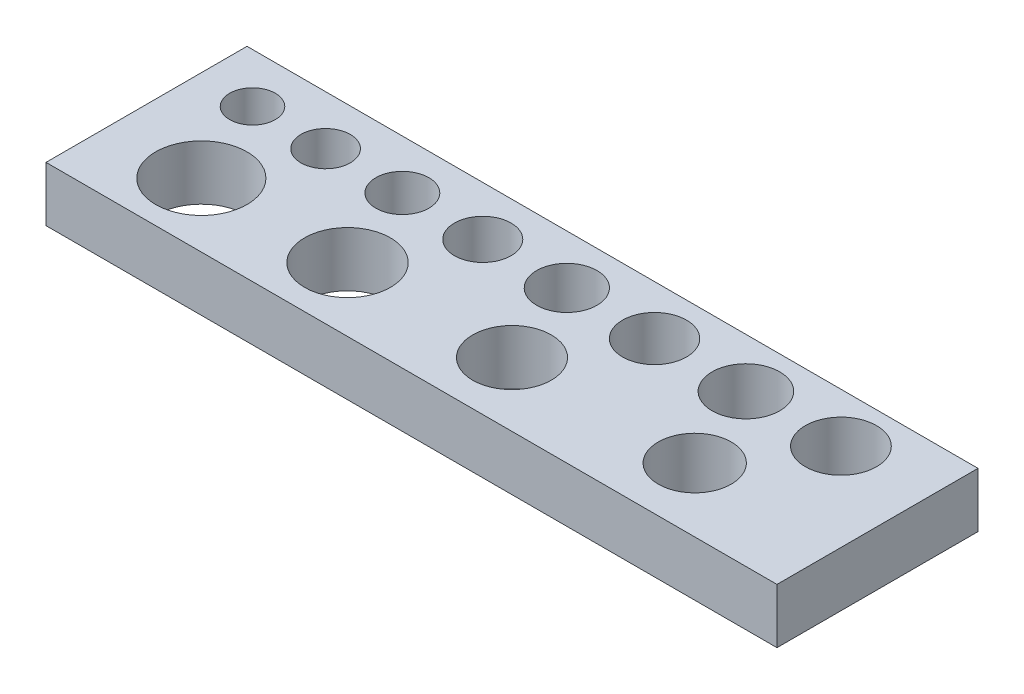
ISO-10303-21;
HEADER;
FILE_DESCRIPTION(('STEP AP214'),'2;1');
FILE_NAME('part.step','',(''),(''),'','','');
FILE_SCHEMA(('AUTOMOTIVE_DESIGN { 1 0 10303 214 1 1 1 1 }'));
ENDSEC;
DATA;
#1=APPLICATION_CONTEXT('core data for automotive mechanical design processes');
#2=APPLICATION_PROTOCOL_DEFINITION('international standard','automotive_design',2000,#1);
#3=PRODUCT_CONTEXT('',#1,'mechanical');
#4=PRODUCT('Part','Part','',(#3));
#5=PRODUCT_RELATED_PRODUCT_CATEGORY('part','',(#4));
#6=PRODUCT_DEFINITION_FORMATION('','',#4);
#7=PRODUCT_DEFINITION_CONTEXT('part definition',#1,'design');
#8=PRODUCT_DEFINITION('design','',#6,#7);
#9=PRODUCT_DEFINITION_SHAPE('','',#8);
#10=(LENGTH_UNIT() NAMED_UNIT(*) SI_UNIT(.MILLI.,.METRE.));
#11=(NAMED_UNIT(*) PLANE_ANGLE_UNIT() SI_UNIT($,.RADIAN.));
#12=(NAMED_UNIT(*) SI_UNIT($,.STERADIAN.) SOLID_ANGLE_UNIT());
#13=UNCERTAINTY_MEASURE_WITH_UNIT(LENGTH_MEASURE(1.E-05),#10,'distance_accuracy_value','');
#14=(GEOMETRIC_REPRESENTATION_CONTEXT(3) GLOBAL_UNCERTAINTY_ASSIGNED_CONTEXT((#13)) GLOBAL_UNIT_ASSIGNED_CONTEXT((#10,
#11,#12)) REPRESENTATION_CONTEXT('',''));
#15=CARTESIAN_POINT('',(0.,0.,0.));
#16=DIRECTION('',(0.,0.,1.));
#17=DIRECTION('',(1.,0.,0.));
#18=AXIS2_PLACEMENT_3D('',#15,#16,#17);
#19=CARTESIAN_POINT('',(-20.,3.,5.5));
#20=DIRECTION('',(1.,0.,0.));
#21=DIRECTION('',(0.,0.,-1.));
#22=AXIS2_PLACEMENT_3D('',#19,#20,#21);
#23=PLANE('',#22);
#24=DIRECTION('',(0.,0.,1.));
#25=VECTOR('',#24,1.);
#26=CARTESIAN_POINT('',(-20.,0.,5.5));
#27=LINE('',#26,#25);
#28=CARTESIAN_POINT('',(-20.,0.,-5.5));
#29=VERTEX_POINT('',#28);
#30=CARTESIAN_POINT('',(-20.,0.,5.5));
#31=VERTEX_POINT('',#30);
#32=EDGE_CURVE('E97',#29,#31,#27,.T.);
#33=ORIENTED_EDGE('',*,*,#32,.T.);
#34=DIRECTION('',(0.,-1.,0.));
#35=VECTOR('',#34,1.);
#36=CARTESIAN_POINT('',(-20.,3.,5.5));
#37=LINE('',#36,#35);
#38=CARTESIAN_POINT('',(-20.,3.,5.5));
#39=VERTEX_POINT('',#38);
#40=EDGE_CURVE('E11',#39,#31,#37,.T.);
#41=ORIENTED_EDGE('',*,*,#40,.F.);
#42=DIRECTION('',(0.,0.,1.));
#43=VECTOR('',#42,1.);
#44=CARTESIAN_POINT('',(-20.,3.,5.5));
#45=LINE('',#44,#43);
#46=CARTESIAN_POINT('',(-20.,3.,-5.5));
#47=VERTEX_POINT('',#46);
#48=EDGE_CURVE('E85',#47,#39,#45,.T.);
#49=ORIENTED_EDGE('',*,*,#48,.F.);
#50=DIRECTION('',(0.,-1.,0.));
#51=VECTOR('',#50,1.);
#52=CARTESIAN_POINT('',(-20.,3.,-5.5));
#53=LINE('',#52,#51);
#54=EDGE_CURVE('E93',#47,#29,#53,.T.);
#55=ORIENTED_EDGE('',*,*,#54,.T.);
#56=EDGE_LOOP('',(#33,#41,#49,#55));
#57=FACE_BOUND('',#56,.T.);
#58=ADVANCED_FACE('F34',(#57),#23,.F.);
#59=CARTESIAN_POINT('',(20.,3.,5.5));
#60=DIRECTION('',(0.,0.,-1.));
#61=DIRECTION('',(-1.,0.,0.));
#62=AXIS2_PLACEMENT_3D('',#59,#60,#61);
#63=PLANE('',#62);
#64=DIRECTION('',(1.,0.,0.));
#65=VECTOR('',#64,1.);
#66=CARTESIAN_POINT('',(20.,0.,5.5));
#67=LINE('',#66,#65);
#68=CARTESIAN_POINT('',(20.,0.,5.5));
#69=VERTEX_POINT('',#68);
#70=EDGE_CURVE('E89',#31,#69,#67,.T.);
#71=ORIENTED_EDGE('',*,*,#70,.T.);
#72=DIRECTION('',(0.,-1.,0.));
#73=VECTOR('',#72,1.);
#74=CARTESIAN_POINT('',(20.,3.,5.5));
#75=LINE('',#74,#73);
#76=CARTESIAN_POINT('',(20.,3.,5.5));
#77=VERTEX_POINT('',#76);
#78=EDGE_CURVE('E42',#77,#69,#75,.T.);
#79=ORIENTED_EDGE('',*,*,#78,.F.);
#80=DIRECTION('',(1.,0.,0.));
#81=VECTOR('',#80,1.);
#82=CARTESIAN_POINT('',(20.,3.,5.5));
#83=LINE('',#82,#81);
#84=EDGE_CURVE('E80',#39,#77,#83,.T.);
#85=ORIENTED_EDGE('',*,*,#84,.F.);
#86=ORIENTED_EDGE('',*,*,#40,.T.);
#87=EDGE_LOOP('',(#71,#79,#85,#86));
#88=FACE_BOUND('',#87,.T.);
#89=ADVANCED_FACE('F88',(#88),#63,.F.);
#90=CARTESIAN_POINT('',(20.,3.,5.5));
#91=DIRECTION('',(-1.,0.,0.));
#92=DIRECTION('',(0.,0.,1.));
#93=AXIS2_PLACEMENT_3D('',#90,#91,#92);
#94=PLANE('',#93);
#95=DIRECTION('',(0.,0.,-1.));
#96=VECTOR('',#95,1.);
#97=CARTESIAN_POINT('',(20.,0.,5.5));
#98=LINE('',#97,#96);
#99=CARTESIAN_POINT('',(20.,0.,-5.5));
#100=VERTEX_POINT('',#99);
#101=EDGE_CURVE('E67',#69,#100,#98,.T.);
#102=ORIENTED_EDGE('',*,*,#101,.T.);
#103=DIRECTION('',(0.,-1.,0.));
#104=VECTOR('',#103,1.);
#105=CARTESIAN_POINT('',(20.,3.,-5.5));
#106=LINE('',#105,#104);
#107=CARTESIAN_POINT('',(20.,3.,-5.5));
#108=VERTEX_POINT('',#107);
#109=EDGE_CURVE('E90',#108,#100,#106,.T.);
#110=ORIENTED_EDGE('',*,*,#109,.F.);
#111=DIRECTION('',(0.,0.,-1.));
#112=VECTOR('',#111,1.);
#113=CARTESIAN_POINT('',(20.,3.,5.5));
#114=LINE('',#113,#112);
#115=EDGE_CURVE('E83',#77,#108,#114,.T.);
#116=ORIENTED_EDGE('',*,*,#115,.F.);
#117=ORIENTED_EDGE('',*,*,#78,.T.);
#118=EDGE_LOOP('',(#102,#110,#116,#117));
#119=FACE_BOUND('',#118,.T.);
#120=ADVANCED_FACE('F91',(#119),#94,.F.);
#121=CARTESIAN_POINT('',(20.,3.,-5.5));
#122=DIRECTION('',(0.,0.,1.));
#123=DIRECTION('',(1.,0.,0.));
#124=AXIS2_PLACEMENT_3D('',#121,#122,#123);
#125=PLANE('',#124);
#126=DIRECTION('',(-1.,0.,0.));
#127=VECTOR('',#126,1.);
#128=CARTESIAN_POINT('',(20.,0.,-5.5));
#129=LINE('',#128,#127);
#130=EDGE_CURVE('E73',#100,#29,#129,.T.);
#131=ORIENTED_EDGE('',*,*,#130,.T.);
#132=ORIENTED_EDGE('',*,*,#54,.F.);
#133=DIRECTION('',(-1.,0.,0.));
#134=VECTOR('',#133,1.);
#135=CARTESIAN_POINT('',(20.,3.,-5.5));
#136=LINE('',#135,#134);
#137=EDGE_CURVE('E50',#108,#47,#136,.T.);
#138=ORIENTED_EDGE('',*,*,#137,.F.);
#139=ORIENTED_EDGE('',*,*,#109,.T.);
#140=EDGE_LOOP('',(#131,#132,#138,#139));
#141=FACE_BOUND('',#140,.T.);
#142=ADVANCED_FACE('F105',(#141),#125,.F.);
#143=CARTESIAN_POINT('',(0.,3.,0.));
#144=DIRECTION('',(0.,1.,0.));
#145=DIRECTION('',(0.,0.,1.));
#146=AXIS2_PLACEMENT_3D('',#143,#144,#145);
#147=PLANE('',#146);
#148=CARTESIAN_POINT('',(5.00000000000001,3.,-2.8));
#149=DIRECTION('',(0.,1.,0.));
#150=DIRECTION('',(0.,0.,1.));
#151=AXIS2_PLACEMENT_3D('',#148,#149,#150);
#152=CIRCLE('',#151,1.75);
#153=CARTESIAN_POINT('',(5.00000000000001,3.,-1.05));
#154=VERTEX_POINT('',#153);
#155=EDGE_CURVE('E148',#154,#154,#152,.T.);
#156=ORIENTED_EDGE('',*,*,#155,.F.);
#157=EDGE_LOOP('',(#156));
#158=FACE_BOUND('',#157,.T.);
#159=CARTESIAN_POINT('',(10.,3.,-2.8));
#160=DIRECTION('',(0.,1.,0.));
#161=DIRECTION('',(0.,0.,1.));
#162=AXIS2_PLACEMENT_3D('',#159,#160,#161);
#163=CIRCLE('',#162,1.85);
#164=CARTESIAN_POINT('',(10.,3.,-0.95));
#165=VERTEX_POINT('',#164);
#166=EDGE_CURVE('E141',#165,#165,#163,.T.);
#167=ORIENTED_EDGE('',*,*,#166,.F.);
#168=EDGE_LOOP('',(#167));
#169=FACE_BOUND('',#168,.T.);
#170=CARTESIAN_POINT('',(15.2,3.,-2.8));
#171=DIRECTION('',(0.,1.,0.));
#172=DIRECTION('',(0.,0.,1.));
#173=AXIS2_PLACEMENT_3D('',#170,#171,#172);
#174=CIRCLE('',#173,1.95);
#175=CARTESIAN_POINT('',(15.2,3.,-0.850000000000002));
#176=VERTEX_POINT('',#175);
#177=EDGE_CURVE('E160',#176,#176,#174,.T.);
#178=ORIENTED_EDGE('',*,*,#177,.F.);
#179=EDGE_LOOP('',(#178));
#180=FACE_BOUND('',#179,.T.);
#181=CARTESIAN_POINT('',(2.00000000000001,3.,2.));
#182=DIRECTION('',(0.,1.,0.));
#183=DIRECTION('',(0.,0.,1.));
#184=AXIS2_PLACEMENT_3D('',#181,#182,#183);
#185=CIRCLE('',#184,2.15);
#186=CARTESIAN_POINT('',(2.00000000000001,3.,4.15));
#187=VERTEX_POINT('',#186);
#188=EDGE_CURVE('E153',#187,#187,#185,.T.);
#189=ORIENTED_EDGE('',*,*,#188,.F.);
#190=EDGE_LOOP('',(#189));
#191=FACE_BOUND('',#190,.T.);
#192=CARTESIAN_POINT('',(0.200000000000007,3.,-2.8));
#193=DIRECTION('',(0.,1.,0.));
#194=DIRECTION('',(0.,0.,1.));
#195=AXIS2_PLACEMENT_3D('',#192,#193,#194);
#196=CIRCLE('',#195,1.65);
#197=CARTESIAN_POINT('',(0.200000000000007,3.,-1.15));
#198=VERTEX_POINT('',#197);
#199=EDGE_CURVE('E117',#198,#198,#196,.T.);
#200=ORIENTED_EDGE('',*,*,#199,.F.);
#201=EDGE_LOOP('',(#200));
#202=FACE_BOUND('',#201,.T.);
#203=CARTESIAN_POINT('',(-4.39999999999999,3.,-2.8));
#204=DIRECTION('',(0.,1.,0.));
#205=DIRECTION('',(0.,0.,1.));
#206=AXIS2_PLACEMENT_3D('',#203,#204,#205);
#207=CIRCLE('',#206,1.55);
#208=CARTESIAN_POINT('',(-4.39999999999999,3.,-1.25));
#209=VERTEX_POINT('',#208);
#210=EDGE_CURVE('E124',#209,#209,#207,.T.);
#211=ORIENTED_EDGE('',*,*,#210,.F.);
#212=EDGE_LOOP('',(#211));
#213=FACE_BOUND('',#212,.T.);
#214=CARTESIAN_POINT('',(-8.79999999999999,3.,-2.8));
#215=DIRECTION('',(0.,1.,0.));
#216=DIRECTION('',(0.,0.,1.));
#217=AXIS2_PLACEMENT_3D('',#214,#215,#216);
#218=CIRCLE('',#217,1.45);
#219=CARTESIAN_POINT('',(-8.79999999999999,3.,-1.35));
#220=VERTEX_POINT('',#219);
#221=EDGE_CURVE('E130',#220,#220,#218,.T.);
#222=ORIENTED_EDGE('',*,*,#221,.F.);
#223=EDGE_LOOP('',(#222));
#224=FACE_BOUND('',#223,.T.);
#225=CARTESIAN_POINT('',(-13.,3.,-2.8));
#226=DIRECTION('',(0.,1.,0.));
#227=DIRECTION('',(0.,0.,1.));
#228=AXIS2_PLACEMENT_3D('',#225,#226,#227);
#229=CIRCLE('',#228,1.35);
#230=CARTESIAN_POINT('',(-13.,3.,-1.45));
#231=VERTEX_POINT('',#230);
#232=EDGE_CURVE('E136',#231,#231,#229,.T.);
#233=ORIENTED_EDGE('',*,*,#232,.F.);
#234=EDGE_LOOP('',(#233));
#235=FACE_BOUND('',#234,.T.);
#236=CARTESIAN_POINT('',(12.,3.,2.));
#237=DIRECTION('',(0.,1.,0.));
#238=DIRECTION('',(0.,0.,1.));
#239=AXIS2_PLACEMENT_3D('',#236,#237,#238);
#240=CIRCLE('',#239,2.);
#241=CARTESIAN_POINT('',(12.,3.,4.00000000000001));
#242=VERTEX_POINT('',#241);
#243=EDGE_CURVE('E177',#242,#242,#240,.T.);
#244=ORIENTED_EDGE('',*,*,#243,.F.);
#245=EDGE_LOOP('',(#244));
#246=FACE_BOUND('',#245,.T.);
#247=CARTESIAN_POINT('',(-6.99999999999999,3.,2.));
#248=DIRECTION('',(0.,1.,0.));
#249=DIRECTION('',(0.,0.,1.));
#250=AXIS2_PLACEMENT_3D('',#247,#248,#249);
#251=CIRCLE('',#250,2.35);
#252=CARTESIAN_POINT('',(-6.99999999999999,3.,4.35));
#253=VERTEX_POINT('',#252);
#254=EDGE_CURVE('E171',#253,#253,#251,.T.);
#255=ORIENTED_EDGE('',*,*,#254,.F.);
#256=EDGE_LOOP('',(#255));
#257=FACE_BOUND('',#256,.T.);
#258=CARTESIAN_POINT('',(-15.,3.,2.));
#259=DIRECTION('',(0.,1.,0.));
#260=DIRECTION('',(0.,0.,1.));
#261=AXIS2_PLACEMENT_3D('',#258,#259,#260);
#262=CIRCLE('',#261,2.5);
#263=CARTESIAN_POINT('',(-15.,3.,4.5));
#264=VERTEX_POINT('',#263);
#265=EDGE_CURVE('E165',#264,#264,#262,.T.);
#266=ORIENTED_EDGE('',*,*,#265,.F.);
#267=EDGE_LOOP('',(#266));
#268=FACE_BOUND('',#267,.T.);
#269=CARTESIAN_POINT('',(-17.,3.,-2.8));
#270=DIRECTION('',(0.,1.,0.));
#271=DIRECTION('',(0.,0.,1.));
#272=AXIS2_PLACEMENT_3D('',#269,#270,#271);
#273=CIRCLE('',#272,1.25);
#274=CARTESIAN_POINT('',(-17.,3.,-1.55));
#275=VERTEX_POINT('',#274);
#276=EDGE_CURVE('E111',#275,#275,#273,.T.);
#277=ORIENTED_EDGE('',*,*,#276,.F.);
#278=EDGE_LOOP('',(#277));
#279=FACE_BOUND('',#278,.T.);
#280=ORIENTED_EDGE('',*,*,#48,.T.);
#281=ORIENTED_EDGE('',*,*,#84,.T.);
#282=ORIENTED_EDGE('',*,*,#115,.T.);
#283=ORIENTED_EDGE('',*,*,#137,.T.);
#284=EDGE_LOOP('',(#280,#281,#282,#283));
#285=FACE_BOUND('',#284,.T.);
#286=ADVANCED_FACE('F81',(#158,#169,#180,#191,#202,#213,#224,#235,#246,#257,#268,#279,#285),
#147,.T.);
#287=CARTESIAN_POINT('',(0.,0.,0.));
#288=DIRECTION('',(0.,1.,0.));
#289=DIRECTION('',(0.,0.,1.));
#290=AXIS2_PLACEMENT_3D('',#287,#288,#289);
#291=PLANE('',#290);
#292=CARTESIAN_POINT('',(5.00000000000001,0.,-2.8));
#293=DIRECTION('',(0.,1.,0.));
#294=DIRECTION('',(0.,0.,1.));
#295=AXIS2_PLACEMENT_3D('',#292,#293,#294);
#296=CIRCLE('',#295,1.75);
#297=CARTESIAN_POINT('',(5.00000000000001,0.,-1.05));
#298=VERTEX_POINT('',#297);
#299=EDGE_CURVE('E121',#298,#298,#296,.T.);
#300=ORIENTED_EDGE('',*,*,#299,.T.);
#301=EDGE_LOOP('',(#300));
#302=FACE_BOUND('',#301,.T.);
#303=CARTESIAN_POINT('',(10.,0.,-2.8));
#304=DIRECTION('',(0.,1.,0.));
#305=DIRECTION('',(0.,0.,1.));
#306=AXIS2_PLACEMENT_3D('',#303,#304,#305);
#307=CIRCLE('',#306,1.85);
#308=CARTESIAN_POINT('',(10.,0.,-0.95));
#309=VERTEX_POINT('',#308);
#310=EDGE_CURVE('E144',#309,#309,#307,.T.);
#311=ORIENTED_EDGE('',*,*,#310,.T.);
#312=EDGE_LOOP('',(#311));
#313=FACE_BOUND('',#312,.T.);
#314=CARTESIAN_POINT('',(15.2,0.,-2.8));
#315=DIRECTION('',(0.,1.,0.));
#316=DIRECTION('',(0.,0.,1.));
#317=AXIS2_PLACEMENT_3D('',#314,#315,#316);
#318=CIRCLE('',#317,1.95);
#319=CARTESIAN_POINT('',(15.2,0.,-0.850000000000002));
#320=VERTEX_POINT('',#319);
#321=EDGE_CURVE('E145',#320,#320,#318,.T.);
#322=ORIENTED_EDGE('',*,*,#321,.T.);
#323=EDGE_LOOP('',(#322));
#324=FACE_BOUND('',#323,.T.);
#325=CARTESIAN_POINT('',(2.00000000000001,0.,2.));
#326=DIRECTION('',(0.,1.,0.));
#327=DIRECTION('',(0.,0.,1.));
#328=AXIS2_PLACEMENT_3D('',#325,#326,#327);
#329=CIRCLE('',#328,2.15);
#330=CARTESIAN_POINT('',(2.00000000000001,0.,4.15));
#331=VERTEX_POINT('',#330);
#332=EDGE_CURVE('E156',#331,#331,#329,.T.);
#333=ORIENTED_EDGE('',*,*,#332,.T.);
#334=EDGE_LOOP('',(#333));
#335=FACE_BOUND('',#334,.T.);
#336=CARTESIAN_POINT('',(0.200000000000007,0.,-2.8));
#337=DIRECTION('',(0.,1.,0.));
#338=DIRECTION('',(0.,0.,1.));
#339=AXIS2_PLACEMENT_3D('',#336,#337,#338);
#340=CIRCLE('',#339,1.65);
#341=CARTESIAN_POINT('',(0.200000000000007,0.,-1.15));
#342=VERTEX_POINT('',#341);
#343=EDGE_CURVE('E120',#342,#342,#340,.T.);
#344=ORIENTED_EDGE('',*,*,#343,.T.);
#345=EDGE_LOOP('',(#344));
#346=FACE_BOUND('',#345,.T.);
#347=CARTESIAN_POINT('',(-4.39999999999999,0.,-2.8));
#348=DIRECTION('',(0.,1.,0.));
#349=DIRECTION('',(0.,0.,1.));
#350=AXIS2_PLACEMENT_3D('',#347,#348,#349);
#351=CIRCLE('',#350,1.55);
#352=CARTESIAN_POINT('',(-4.39999999999999,0.,-1.25));
#353=VERTEX_POINT('',#352);
#354=EDGE_CURVE('E127',#353,#353,#351,.T.);
#355=ORIENTED_EDGE('',*,*,#354,.T.);
#356=EDGE_LOOP('',(#355));
#357=FACE_BOUND('',#356,.T.);
#358=CARTESIAN_POINT('',(-8.79999999999999,0.,-2.8));
#359=DIRECTION('',(0.,1.,0.));
#360=DIRECTION('',(0.,0.,1.));
#361=AXIS2_PLACEMENT_3D('',#358,#359,#360);
#362=CIRCLE('',#361,1.45);
#363=CARTESIAN_POINT('',(-8.79999999999999,0.,-1.35));
#364=VERTEX_POINT('',#363);
#365=EDGE_CURVE('E133',#364,#364,#362,.T.);
#366=ORIENTED_EDGE('',*,*,#365,.T.);
#367=EDGE_LOOP('',(#366));
#368=FACE_BOUND('',#367,.T.);
#369=CARTESIAN_POINT('',(-13.,0.,-2.8));
#370=DIRECTION('',(0.,1.,0.));
#371=DIRECTION('',(0.,0.,1.));
#372=AXIS2_PLACEMENT_3D('',#369,#370,#371);
#373=CIRCLE('',#372,1.35);
#374=CARTESIAN_POINT('',(-13.,0.,-1.45));
#375=VERTEX_POINT('',#374);
#376=EDGE_CURVE('E114',#375,#375,#373,.T.);
#377=ORIENTED_EDGE('',*,*,#376,.T.);
#378=EDGE_LOOP('',(#377));
#379=FACE_BOUND('',#378,.T.);
#380=CARTESIAN_POINT('',(12.,0.,2.));
#381=DIRECTION('',(0.,1.,0.));
#382=DIRECTION('',(0.,0.,1.));
#383=AXIS2_PLACEMENT_3D('',#380,#381,#382);
#384=CIRCLE('',#383,2.);
#385=CARTESIAN_POINT('',(12.,0.,4.00000000000001));
#386=VERTEX_POINT('',#385);
#387=EDGE_CURVE('E157',#386,#386,#384,.T.);
#388=ORIENTED_EDGE('',*,*,#387,.T.);
#389=EDGE_LOOP('',(#388));
#390=FACE_BOUND('',#389,.T.);
#391=CARTESIAN_POINT('',(-6.99999999999999,0.,2.));
#392=DIRECTION('',(0.,1.,0.));
#393=DIRECTION('',(0.,0.,1.));
#394=AXIS2_PLACEMENT_3D('',#391,#392,#393);
#395=CIRCLE('',#394,2.35);
#396=CARTESIAN_POINT('',(-6.99999999999999,0.,4.35));
#397=VERTEX_POINT('',#396);
#398=EDGE_CURVE('E174',#397,#397,#395,.T.);
#399=ORIENTED_EDGE('',*,*,#398,.T.);
#400=EDGE_LOOP('',(#399));
#401=FACE_BOUND('',#400,.T.);
#402=CARTESIAN_POINT('',(-15.,0.,2.));
#403=DIRECTION('',(0.,1.,0.));
#404=DIRECTION('',(0.,0.,1.));
#405=AXIS2_PLACEMENT_3D('',#402,#403,#404);
#406=CIRCLE('',#405,2.5);
#407=CARTESIAN_POINT('',(-15.,0.,4.5));
#408=VERTEX_POINT('',#407);
#409=EDGE_CURVE('E168',#408,#408,#406,.T.);
#410=ORIENTED_EDGE('',*,*,#409,.T.);
#411=EDGE_LOOP('',(#410));
#412=FACE_BOUND('',#411,.T.);
#413=CARTESIAN_POINT('',(-17.,0.,-2.8));
#414=DIRECTION('',(0.,1.,0.));
#415=DIRECTION('',(0.,0.,1.));
#416=AXIS2_PLACEMENT_3D('',#413,#414,#415);
#417=CIRCLE('',#416,1.25);
#418=CARTESIAN_POINT('',(-17.,0.,-1.55));
#419=VERTEX_POINT('',#418);
#420=EDGE_CURVE('E100',#419,#419,#417,.T.);
#421=ORIENTED_EDGE('',*,*,#420,.T.);
#422=EDGE_LOOP('',(#421));
#423=FACE_BOUND('',#422,.T.);
#424=ORIENTED_EDGE('',*,*,#32,.F.);
#425=ORIENTED_EDGE('',*,*,#130,.F.);
#426=ORIENTED_EDGE('',*,*,#101,.F.);
#427=ORIENTED_EDGE('',*,*,#70,.F.);
#428=EDGE_LOOP('',(#424,#425,#426,#427));
#429=FACE_BOUND('',#428,.T.);
#430=ADVANCED_FACE('F108',(#302,#313,#324,#335,#346,#357,#368,#379,#390,#401,#412,#423,#429),
#291,.F.);
#431=CARTESIAN_POINT('',(-17.,0.,-2.8));
#432=DIRECTION('',(0.,1.,0.));
#433=DIRECTION('',(0.,0.,1.));
#434=AXIS2_PLACEMENT_3D('',#431,#432,#433);
#435=CYLINDRICAL_SURFACE('',#434,1.25);
#436=ORIENTED_EDGE('',*,*,#420,.F.);
#437=EDGE_LOOP('',(#436));
#438=FACE_BOUND('',#437,.T.);
#439=ORIENTED_EDGE('',*,*,#276,.T.);
#440=EDGE_LOOP('',(#439));
#441=FACE_BOUND('',#440,.T.);
#442=ADVANCED_FACE('F203',(#438,#441),#435,.F.);
#443=CARTESIAN_POINT('',(-15.,0.,2.));
#444=DIRECTION('',(0.,1.,0.));
#445=DIRECTION('',(0.,0.,1.));
#446=AXIS2_PLACEMENT_3D('',#443,#444,#445);
#447=CYLINDRICAL_SURFACE('',#446,2.5);
#448=ORIENTED_EDGE('',*,*,#409,.F.);
#449=EDGE_LOOP('',(#448));
#450=FACE_BOUND('',#449,.T.);
#451=ORIENTED_EDGE('',*,*,#265,.T.);
#452=EDGE_LOOP('',(#451));
#453=FACE_BOUND('',#452,.T.);
#454=ADVANCED_FACE('F205',(#450,#453),#447,.F.);
#455=CARTESIAN_POINT('',(-6.99999999999999,0.,2.));
#456=DIRECTION('',(0.,1.,0.));
#457=DIRECTION('',(0.,0.,1.));
#458=AXIS2_PLACEMENT_3D('',#455,#456,#457);
#459=CYLINDRICAL_SURFACE('',#458,2.35);
#460=ORIENTED_EDGE('',*,*,#398,.F.);
#461=EDGE_LOOP('',(#460));
#462=FACE_BOUND('',#461,.T.);
#463=ORIENTED_EDGE('',*,*,#254,.T.);
#464=EDGE_LOOP('',(#463));
#465=FACE_BOUND('',#464,.T.);
#466=ADVANCED_FACE('F189',(#462,#465),#459,.F.);
#467=CARTESIAN_POINT('',(12.,0.,2.));
#468=DIRECTION('',(0.,1.,0.));
#469=DIRECTION('',(0.,0.,1.));
#470=AXIS2_PLACEMENT_3D('',#467,#468,#469);
#471=CYLINDRICAL_SURFACE('',#470,2.);
#472=ORIENTED_EDGE('',*,*,#387,.F.);
#473=EDGE_LOOP('',(#472));
#474=FACE_BOUND('',#473,.T.);
#475=ORIENTED_EDGE('',*,*,#243,.T.);
#476=EDGE_LOOP('',(#475));
#477=FACE_BOUND('',#476,.T.);
#478=ADVANCED_FACE('F185',(#474,#477),#471,.F.);
#479=CARTESIAN_POINT('',(-13.,0.,-2.8));
#480=DIRECTION('',(0.,1.,0.));
#481=DIRECTION('',(0.,0.,1.));
#482=AXIS2_PLACEMENT_3D('',#479,#480,#481);
#483=CYLINDRICAL_SURFACE('',#482,1.35);
#484=ORIENTED_EDGE('',*,*,#376,.F.);
#485=EDGE_LOOP('',(#484));
#486=FACE_BOUND('',#485,.T.);
#487=ORIENTED_EDGE('',*,*,#232,.T.);
#488=EDGE_LOOP('',(#487));
#489=FACE_BOUND('',#488,.T.);
#490=ADVANCED_FACE('F188',(#486,#489),#483,.F.);
#491=CARTESIAN_POINT('',(-8.79999999999999,0.,-2.8));
#492=DIRECTION('',(0.,1.,0.));
#493=DIRECTION('',(0.,0.,1.));
#494=AXIS2_PLACEMENT_3D('',#491,#492,#493);
#495=CYLINDRICAL_SURFACE('',#494,1.45);
#496=ORIENTED_EDGE('',*,*,#365,.F.);
#497=EDGE_LOOP('',(#496));
#498=FACE_BOUND('',#497,.T.);
#499=ORIENTED_EDGE('',*,*,#221,.T.);
#500=EDGE_LOOP('',(#499));
#501=FACE_BOUND('',#500,.T.);
#502=ADVANCED_FACE('F274',(#498,#501),#495,.F.);
#503=CARTESIAN_POINT('',(-4.39999999999999,0.,-2.8));
#504=DIRECTION('',(0.,1.,0.));
#505=DIRECTION('',(0.,0.,1.));
#506=AXIS2_PLACEMENT_3D('',#503,#504,#505);
#507=CYLINDRICAL_SURFACE('',#506,1.55);
#508=ORIENTED_EDGE('',*,*,#354,.F.);
#509=EDGE_LOOP('',(#508));
#510=FACE_BOUND('',#509,.T.);
#511=ORIENTED_EDGE('',*,*,#210,.T.);
#512=EDGE_LOOP('',(#511));
#513=FACE_BOUND('',#512,.T.);
#514=ADVANCED_FACE('F284',(#510,#513),#507,.F.);
#515=CARTESIAN_POINT('',(0.200000000000007,0.,-2.8));
#516=DIRECTION('',(0.,1.,0.));
#517=DIRECTION('',(0.,0.,1.));
#518=AXIS2_PLACEMENT_3D('',#515,#516,#517);
#519=CYLINDRICAL_SURFACE('',#518,1.65);
#520=ORIENTED_EDGE('',*,*,#343,.F.);
#521=EDGE_LOOP('',(#520));
#522=FACE_BOUND('',#521,.T.);
#523=ORIENTED_EDGE('',*,*,#199,.T.);
#524=EDGE_LOOP('',(#523));
#525=FACE_BOUND('',#524,.T.);
#526=ADVANCED_FACE('F294',(#522,#525),#519,.F.);
#527=CARTESIAN_POINT('',(2.00000000000001,0.,2.));
#528=DIRECTION('',(0.,1.,0.));
#529=DIRECTION('',(0.,0.,1.));
#530=AXIS2_PLACEMENT_3D('',#527,#528,#529);
#531=CYLINDRICAL_SURFACE('',#530,2.15);
#532=ORIENTED_EDGE('',*,*,#332,.F.);
#533=EDGE_LOOP('',(#532));
#534=FACE_BOUND('',#533,.T.);
#535=ORIENTED_EDGE('',*,*,#188,.T.);
#536=EDGE_LOOP('',(#535));
#537=FACE_BOUND('',#536,.T.);
#538=ADVANCED_FACE('F304',(#534,#537),#531,.F.);
#539=CARTESIAN_POINT('',(15.2,0.,-2.8));
#540=DIRECTION('',(0.,1.,0.));
#541=DIRECTION('',(0.,0.,1.));
#542=AXIS2_PLACEMENT_3D('',#539,#540,#541);
#543=CYLINDRICAL_SURFACE('',#542,1.95);
#544=ORIENTED_EDGE('',*,*,#321,.F.);
#545=EDGE_LOOP('',(#544));
#546=FACE_BOUND('',#545,.T.);
#547=ORIENTED_EDGE('',*,*,#177,.T.);
#548=EDGE_LOOP('',(#547));
#549=FACE_BOUND('',#548,.T.);
#550=ADVANCED_FACE('F313',(#546,#549),#543,.F.);
#551=CARTESIAN_POINT('',(10.,0.,-2.8));
#552=DIRECTION('',(0.,1.,0.));
#553=DIRECTION('',(0.,0.,1.));
#554=AXIS2_PLACEMENT_3D('',#551,#552,#553);
#555=CYLINDRICAL_SURFACE('',#554,1.85);
#556=ORIENTED_EDGE('',*,*,#310,.F.);
#557=EDGE_LOOP('',(#556));
#558=FACE_BOUND('',#557,.T.);
#559=ORIENTED_EDGE('',*,*,#166,.T.);
#560=EDGE_LOOP('',(#559));
#561=FACE_BOUND('',#560,.T.);
#562=ADVANCED_FACE('F323',(#558,#561),#555,.F.);
#563=CARTESIAN_POINT('',(5.00000000000001,0.,-2.8));
#564=DIRECTION('',(0.,1.,0.));
#565=DIRECTION('',(0.,0.,1.));
#566=AXIS2_PLACEMENT_3D('',#563,#564,#565);
#567=CYLINDRICAL_SURFACE('',#566,1.75);
#568=ORIENTED_EDGE('',*,*,#299,.F.);
#569=EDGE_LOOP('',(#568));
#570=FACE_BOUND('',#569,.T.);
#571=ORIENTED_EDGE('',*,*,#155,.T.);
#572=EDGE_LOOP('',(#571));
#573=FACE_BOUND('',#572,.T.);
#574=ADVANCED_FACE('F333',(#570,#573),#567,.F.);
#575=CLOSED_SHELL('',(#58,#89,#120,#142,#286,#430,#442,#454,#466,#478,#490,#502,#514,#526,#538,
#550,#562,#574));
#576=MANIFOLD_SOLID_BREP('B2',#575);
#577=ADVANCED_BREP_SHAPE_REPRESENTATION('',(#18,#576),#14);
#578=SHAPE_DEFINITION_REPRESENTATION(#9,#577);
ENDSEC;
END-ISO-10303-21;
